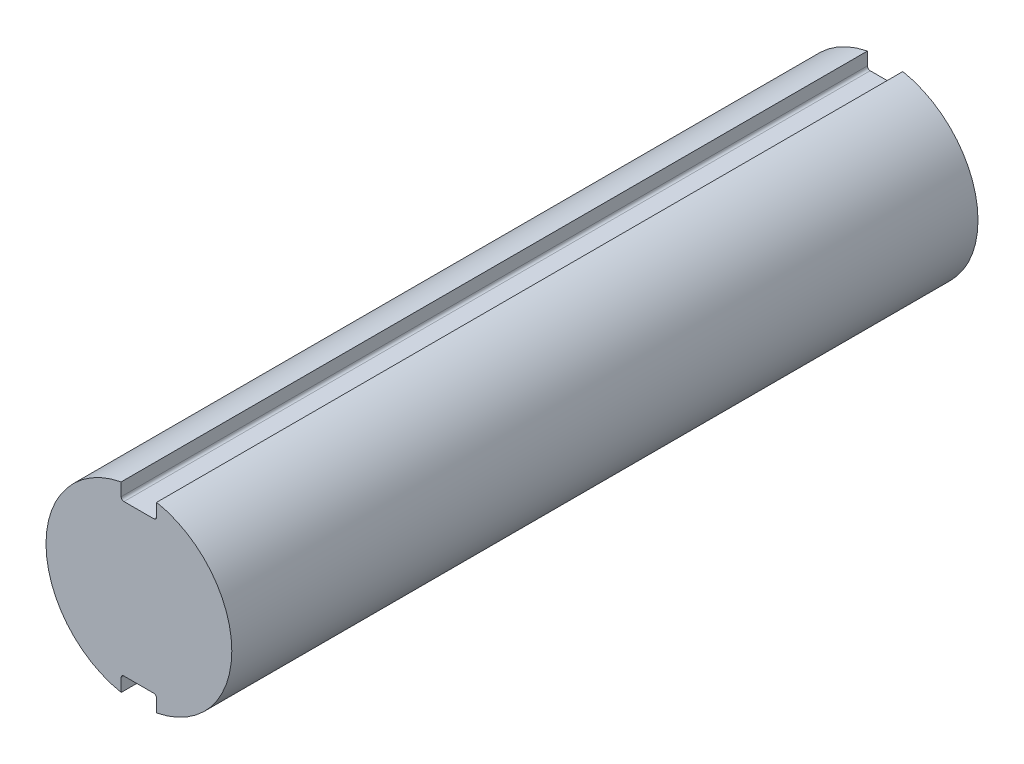
ISO-10303-21;
HEADER;
FILE_DESCRIPTION(('STEP AP214'),'2;1');
FILE_NAME('part.step','',(''),(''),'','','');
FILE_SCHEMA(('AUTOMOTIVE_DESIGN { 1 0 10303 214 1 1 1 1 }'));
ENDSEC;
DATA;
#1=APPLICATION_CONTEXT('core data for automotive mechanical design processes');
#2=APPLICATION_PROTOCOL_DEFINITION('international standard','automotive_design',2000,#1);
#3=PRODUCT_CONTEXT('',#1,'mechanical');
#4=PRODUCT('Part','Part','',(#3));
#5=PRODUCT_RELATED_PRODUCT_CATEGORY('part','',(#4));
#6=PRODUCT_DEFINITION_FORMATION('','',#4);
#7=PRODUCT_DEFINITION_CONTEXT('part definition',#1,'design');
#8=PRODUCT_DEFINITION('design','',#6,#7);
#9=PRODUCT_DEFINITION_SHAPE('','',#8);
#10=(LENGTH_UNIT() NAMED_UNIT(*) SI_UNIT(.MILLI.,.METRE.));
#11=(NAMED_UNIT(*) PLANE_ANGLE_UNIT() SI_UNIT($,.RADIAN.));
#12=(NAMED_UNIT(*) SI_UNIT($,.STERADIAN.) SOLID_ANGLE_UNIT());
#13=UNCERTAINTY_MEASURE_WITH_UNIT(LENGTH_MEASURE(1.E-05),#10,'distance_accuracy_value','');
#14=(GEOMETRIC_REPRESENTATION_CONTEXT(3) GLOBAL_UNCERTAINTY_ASSIGNED_CONTEXT((#13)) GLOBAL_UNIT_ASSIGNED_CONTEXT((#10,
#11,#12)) REPRESENTATION_CONTEXT('',''));
#15=CARTESIAN_POINT('',(0.,0.,0.));
#16=DIRECTION('',(0.,0.,1.));
#17=DIRECTION('',(1.,0.,0.));
#18=AXIS2_PLACEMENT_3D('',#15,#16,#17);
#19=CARTESIAN_POINT('',(-4.75000000000004,0.,200.));
#20=DIRECTION('',(-1.,0.,0.));
#21=DIRECTION('',(0.,-1.,0.));
#22=AXIS2_PLACEMENT_3D('',#19,#20,#21);
#23=PLANE('',#22);
#24=DIRECTION('',(0.,1.,0.));
#25=VECTOR('',#24,1.);
#26=CARTESIAN_POINT('',(-4.75000000000004,0.,0.));
#27=LINE('',#26,#25);
#28=CARTESIAN_POINT('',(-4.75,21.,0.));
#29=VERTEX_POINT('',#28);
#30=CARTESIAN_POINT('',(-4.74999999999999,24.4427392081984,0.));
#31=VERTEX_POINT('',#30);
#32=EDGE_CURVE('E153',#29,#31,#27,.T.);
#33=ORIENTED_EDGE('',*,*,#32,.T.);
#34=DIRECTION('',(0.,0.,-1.));
#35=VECTOR('',#34,1.);
#36=CARTESIAN_POINT('',(-4.74999999999999,24.4427392081984,200.));
#37=LINE('',#36,#35);
#38=CARTESIAN_POINT('',(-4.74999999999999,24.4427392081984,200.));
#39=VERTEX_POINT('',#38);
#40=EDGE_CURVE('E11',#39,#31,#37,.T.);
#41=ORIENTED_EDGE('',*,*,#40,.F.);
#42=DIRECTION('',(0.,1.,0.));
#43=VECTOR('',#42,1.);
#44=CARTESIAN_POINT('',(-4.75000000000004,0.,200.));
#45=LINE('',#44,#43);
#46=CARTESIAN_POINT('',(-4.75,21.,200.));
#47=VERTEX_POINT('',#46);
#48=EDGE_CURVE('E184',#47,#39,#45,.T.);
#49=ORIENTED_EDGE('',*,*,#48,.F.);
#50=DIRECTION('',(0.,0.,-1.));
#51=VECTOR('',#50,1.);
#52=CARTESIAN_POINT('',(-4.75,21.,200.));
#53=LINE('',#52,#51);
#54=EDGE_CURVE('E49',#47,#29,#53,.T.);
#55=ORIENTED_EDGE('',*,*,#54,.T.);
#56=EDGE_LOOP('',(#33,#41,#49,#55));
#57=FACE_BOUND('',#56,.T.);
#58=ADVANCED_FACE('F33',(#57),#23,.F.);
#59=CARTESIAN_POINT('',(0.,0.,200.));
#60=DIRECTION('',(0.,0.,-1.));
#61=DIRECTION('',(-1.,0.,0.));
#62=AXIS2_PLACEMENT_3D('',#59,#60,#61);
#63=CYLINDRICAL_SURFACE('',#62,24.9);
#64=CARTESIAN_POINT('',(0.,0.,0.));
#65=DIRECTION('',(0.,0.,1.));
#66=DIRECTION('',(1.,0.,0.));
#67=AXIS2_PLACEMENT_3D('',#64,#65,#66);
#68=CIRCLE('',#67,24.9);
#69=CARTESIAN_POINT('',(-4.75000000000022,-24.4427392081984,0.));
#70=VERTEX_POINT('',#69);
#71=EDGE_CURVE('E155',#31,#70,#68,.T.);
#72=ORIENTED_EDGE('',*,*,#71,.T.);
#73=DIRECTION('',(0.,0.,-1.));
#74=VECTOR('',#73,1.);
#75=CARTESIAN_POINT('',(-4.75000000000022,-24.4427392081984,200.));
#76=LINE('',#75,#74);
#77=CARTESIAN_POINT('',(-4.75000000000022,-24.4427392081984,200.));
#78=VERTEX_POINT('',#77);
#79=EDGE_CURVE('E41',#78,#70,#76,.T.);
#80=ORIENTED_EDGE('',*,*,#79,.F.);
#81=CARTESIAN_POINT('',(0.,0.,200.));
#82=DIRECTION('',(0.,0.,1.));
#83=DIRECTION('',(1.,0.,0.));
#84=AXIS2_PLACEMENT_3D('',#81,#82,#83);
#85=CIRCLE('',#84,24.9);
#86=EDGE_CURVE('E99',#39,#78,#85,.T.);
#87=ORIENTED_EDGE('',*,*,#86,.F.);
#88=ORIENTED_EDGE('',*,*,#40,.T.);
#89=EDGE_LOOP('',(#72,#80,#87,#88));
#90=FACE_BOUND('',#89,.T.);
#91=ADVANCED_FACE('F206',(#90),#63,.T.);
#92=CARTESIAN_POINT('',(-4.75,0.,200.));
#93=DIRECTION('',(1.,0.,0.));
#94=DIRECTION('',(0.,1.,0.));
#95=AXIS2_PLACEMENT_3D('',#92,#93,#94);
#96=PLANE('',#95);
#97=DIRECTION('',(0.,-1.,0.));
#98=VECTOR('',#97,1.);
#99=CARTESIAN_POINT('',(-4.75,0.,0.));
#100=LINE('',#99,#98);
#101=CARTESIAN_POINT('',(-4.75000000000019,-21.,0.));
#102=VERTEX_POINT('',#101);
#103=EDGE_CURVE('E158',#102,#70,#100,.T.);
#104=ORIENTED_EDGE('',*,*,#103,.F.);
#105=DIRECTION('',(0.,0.,-1.));
#106=VECTOR('',#105,1.);
#107=CARTESIAN_POINT('',(-4.75000000000019,-21.,200.));
#108=LINE('',#107,#106);
#109=CARTESIAN_POINT('',(-4.75000000000019,-21.,200.));
#110=VERTEX_POINT('',#109);
#111=EDGE_CURVE('E199',#110,#102,#108,.T.);
#112=ORIENTED_EDGE('',*,*,#111,.F.);
#113=DIRECTION('',(0.,-1.,0.));
#114=VECTOR('',#113,1.);
#115=CARTESIAN_POINT('',(-4.75,0.,200.));
#116=LINE('',#115,#114);
#117=EDGE_CURVE('E205',#110,#78,#116,.T.);
#118=ORIENTED_EDGE('',*,*,#117,.T.);
#119=ORIENTED_EDGE('',*,*,#79,.T.);
#120=EDGE_LOOP('',(#104,#112,#118,#119));
#121=FACE_BOUND('',#120,.T.);
#122=ADVANCED_FACE('F203',(#121),#96,.T.);
#123=CARTESIAN_POINT('',(-4.00000000000016,-21.,200.));
#124=DIRECTION('',(0.,0.,-1.));
#125=DIRECTION('',(-1.,0.,0.));
#126=AXIS2_PLACEMENT_3D('',#123,#124,#125);
#127=CYLINDRICAL_SURFACE('',#126,0.750000000000015);
#128=CARTESIAN_POINT('',(-4.00000000000016,-21.,0.));
#129=DIRECTION('',(0.,0.,1.));
#130=DIRECTION('',(1.,0.,0.));
#131=AXIS2_PLACEMENT_3D('',#128,#129,#130);
#132=CIRCLE('',#131,0.750000000000015);
#133=CARTESIAN_POINT('',(-4.00000000000015,-20.25,0.));
#134=VERTEX_POINT('',#133);
#135=EDGE_CURVE('E161',#134,#102,#132,.T.);
#136=ORIENTED_EDGE('',*,*,#135,.F.);
#137=DIRECTION('',(0.,0.,-1.));
#138=VECTOR('',#137,1.);
#139=CARTESIAN_POINT('',(-4.00000000000015,-20.25,200.));
#140=LINE('',#139,#138);
#141=CARTESIAN_POINT('',(-4.00000000000015,-20.25,200.));
#142=VERTEX_POINT('',#141);
#143=EDGE_CURVE('E197',#142,#134,#140,.T.);
#144=ORIENTED_EDGE('',*,*,#143,.F.);
#145=CARTESIAN_POINT('',(-4.00000000000016,-21.,200.));
#146=DIRECTION('',(0.,0.,1.));
#147=DIRECTION('',(1.,0.,0.));
#148=AXIS2_PLACEMENT_3D('',#145,#146,#147);
#149=CIRCLE('',#148,0.750000000000015);
#150=EDGE_CURVE('E216',#142,#110,#149,.T.);
#151=ORIENTED_EDGE('',*,*,#150,.T.);
#152=ORIENTED_EDGE('',*,*,#111,.T.);
#153=EDGE_LOOP('',(#136,#144,#151,#152));
#154=FACE_BOUND('',#153,.T.);
#155=ADVANCED_FACE('F213',(#154),#127,.F.);
#156=CARTESIAN_POINT('',(1.36999786515266E-12,-20.2499999999997,200.));
#157=DIRECTION('',(0.,-1.,0.));
#158=DIRECTION('',(1.,0.,0.));
#159=AXIS2_PLACEMENT_3D('',#156,#157,#158);
#160=PLANE('',#159);
#161=DIRECTION('',(-1.,0.,0.));
#162=VECTOR('',#161,1.);
#163=CARTESIAN_POINT('',(1.36999786515266E-12,-20.2499999999997,0.));
#164=LINE('',#163,#162);
#165=CARTESIAN_POINT('',(3.99999999999982,-20.25,0.));
#166=VERTEX_POINT('',#165);
#167=EDGE_CURVE('E164',#166,#134,#164,.T.);
#168=ORIENTED_EDGE('',*,*,#167,.F.);
#169=DIRECTION('',(0.,0.,-1.));
#170=VECTOR('',#169,1.);
#171=CARTESIAN_POINT('',(3.99999999999982,-20.25,200.));
#172=LINE('',#171,#170);
#173=CARTESIAN_POINT('',(3.99999999999982,-20.25,200.));
#174=VERTEX_POINT('',#173);
#175=EDGE_CURVE('E195',#174,#166,#172,.T.);
#176=ORIENTED_EDGE('',*,*,#175,.F.);
#177=DIRECTION('',(-1.,0.,0.));
#178=VECTOR('',#177,1.);
#179=CARTESIAN_POINT('',(1.36999786515266E-12,-20.2499999999997,200.));
#180=LINE('',#179,#178);
#181=EDGE_CURVE('E220',#174,#142,#180,.T.);
#182=ORIENTED_EDGE('',*,*,#181,.T.);
#183=ORIENTED_EDGE('',*,*,#143,.T.);
#184=EDGE_LOOP('',(#168,#176,#182,#183));
#185=FACE_BOUND('',#184,.T.);
#186=ADVANCED_FACE('F258',(#185),#160,.T.);
#187=CARTESIAN_POINT('',(3.99999999999984,-21.0000000000001,200.));
#188=DIRECTION('',(0.,0.,-1.));
#189=DIRECTION('',(-1.,0.,0.));
#190=AXIS2_PLACEMENT_3D('',#187,#188,#189);
#191=CYLINDRICAL_SURFACE('',#190,0.750000000000013);
#192=CARTESIAN_POINT('',(3.99999999999984,-21.0000000000001,0.));
#193=DIRECTION('',(0.,0.,1.));
#194=DIRECTION('',(1.,0.,0.));
#195=AXIS2_PLACEMENT_3D('',#192,#193,#194);
#196=CIRCLE('',#195,0.750000000000013);
#197=CARTESIAN_POINT('',(4.74999999999985,-21.0000000000001,0.));
#198=VERTEX_POINT('',#197);
#199=EDGE_CURVE('E167',#198,#166,#196,.T.);
#200=ORIENTED_EDGE('',*,*,#199,.F.);
#201=DIRECTION('',(0.,0.,-1.));
#202=VECTOR('',#201,1.);
#203=CARTESIAN_POINT('',(4.74999999999985,-21.0000000000001,200.));
#204=LINE('',#203,#202);
#205=CARTESIAN_POINT('',(4.74999999999985,-21.0000000000001,200.));
#206=VERTEX_POINT('',#205);
#207=EDGE_CURVE('E193',#206,#198,#204,.T.);
#208=ORIENTED_EDGE('',*,*,#207,.F.);
#209=CARTESIAN_POINT('',(3.99999999999984,-21.0000000000001,200.));
#210=DIRECTION('',(0.,0.,1.));
#211=DIRECTION('',(1.,0.,0.));
#212=AXIS2_PLACEMENT_3D('',#209,#210,#211);
#213=CIRCLE('',#212,0.750000000000013);
#214=EDGE_CURVE('E226',#206,#174,#213,.T.);
#215=ORIENTED_EDGE('',*,*,#214,.T.);
#216=ORIENTED_EDGE('',*,*,#175,.T.);
#217=EDGE_LOOP('',(#200,#208,#215,#216));
#218=FACE_BOUND('',#217,.T.);
#219=ADVANCED_FACE('F261',(#218),#191,.F.);
#220=CARTESIAN_POINT('',(4.75000000000004,0.,200.));
#221=DIRECTION('',(1.,0.,0.));
#222=DIRECTION('',(0.,1.,0.));
#223=AXIS2_PLACEMENT_3D('',#220,#221,#222);
#224=PLANE('',#223);
#225=DIRECTION('',(0.,-1.,0.));
#226=VECTOR('',#225,1.);
#227=CARTESIAN_POINT('',(4.75000000000004,0.,0.));
#228=LINE('',#227,#226);
#229=CARTESIAN_POINT('',(4.74999999999982,-24.4427392081985,0.));
#230=VERTEX_POINT('',#229);
#231=EDGE_CURVE('E170',#198,#230,#228,.T.);
#232=ORIENTED_EDGE('',*,*,#231,.T.);
#233=DIRECTION('',(0.,0.,-1.));
#234=VECTOR('',#233,1.);
#235=CARTESIAN_POINT('',(4.74999999999982,-24.4427392081985,200.));
#236=LINE('',#235,#234);
#237=CARTESIAN_POINT('',(4.74999999999982,-24.4427392081985,200.));
#238=VERTEX_POINT('',#237);
#239=EDGE_CURVE('E190',#238,#230,#236,.T.);
#240=ORIENTED_EDGE('',*,*,#239,.F.);
#241=DIRECTION('',(0.,-1.,0.));
#242=VECTOR('',#241,1.);
#243=CARTESIAN_POINT('',(4.75000000000004,0.,200.));
#244=LINE('',#243,#242);
#245=EDGE_CURVE('E229',#206,#238,#244,.T.);
#246=ORIENTED_EDGE('',*,*,#245,.F.);
#247=ORIENTED_EDGE('',*,*,#207,.T.);
#248=EDGE_LOOP('',(#232,#240,#246,#247));
#249=FACE_BOUND('',#248,.T.);
#250=ADVANCED_FACE('F265',(#249),#224,.F.);
#251=CARTESIAN_POINT('',(0.,0.,200.));
#252=DIRECTION('',(0.,0.,-1.));
#253=DIRECTION('',(-1.,0.,0.));
#254=AXIS2_PLACEMENT_3D('',#251,#252,#253);
#255=CYLINDRICAL_SURFACE('',#254,24.9);
#256=CARTESIAN_POINT('',(0.,0.,0.));
#257=DIRECTION('',(0.,0.,1.));
#258=DIRECTION('',(1.,0.,0.));
#259=AXIS2_PLACEMENT_3D('',#256,#257,#258);
#260=CIRCLE('',#259,24.9);
#261=CARTESIAN_POINT('',(4.75000000000005,24.4427392081984,0.));
#262=VERTEX_POINT('',#261);
#263=EDGE_CURVE('E172',#230,#262,#260,.T.);
#264=ORIENTED_EDGE('',*,*,#263,.T.);
#265=DIRECTION('',(0.,0.,-1.));
#266=VECTOR('',#265,1.);
#267=CARTESIAN_POINT('',(4.75000000000005,24.4427392081984,200.));
#268=LINE('',#267,#266);
#269=CARTESIAN_POINT('',(4.75000000000005,24.4427392081984,200.));
#270=VERTEX_POINT('',#269);
#271=EDGE_CURVE('E188',#270,#262,#268,.T.);
#272=ORIENTED_EDGE('',*,*,#271,.F.);
#273=CARTESIAN_POINT('',(0.,0.,200.));
#274=DIRECTION('',(0.,0.,1.));
#275=DIRECTION('',(1.,0.,0.));
#276=AXIS2_PLACEMENT_3D('',#273,#274,#275);
#277=CIRCLE('',#276,24.9);
#278=EDGE_CURVE('E231',#238,#270,#277,.T.);
#279=ORIENTED_EDGE('',*,*,#278,.F.);
#280=ORIENTED_EDGE('',*,*,#239,.T.);
#281=EDGE_LOOP('',(#264,#272,#279,#280));
#282=FACE_BOUND('',#281,.T.);
#283=ADVANCED_FACE('F269',(#282),#255,.T.);
#284=CARTESIAN_POINT('',(4.75,0.,200.));
#285=DIRECTION('',(-1.,0.,0.));
#286=DIRECTION('',(0.,-1.,0.));
#287=AXIS2_PLACEMENT_3D('',#284,#285,#286);
#288=PLANE('',#287);
#289=DIRECTION('',(0.,1.,0.));
#290=VECTOR('',#289,1.);
#291=CARTESIAN_POINT('',(4.75,0.,0.));
#292=LINE('',#291,#290);
#293=CARTESIAN_POINT('',(4.75000000000004,21.,0.));
#294=VERTEX_POINT('',#293);
#295=EDGE_CURVE('E175',#294,#262,#292,.T.);
#296=ORIENTED_EDGE('',*,*,#295,.F.);
#297=DIRECTION('',(0.,0.,-1.));
#298=VECTOR('',#297,1.);
#299=CARTESIAN_POINT('',(4.75000000000004,21.,200.));
#300=LINE('',#299,#298);
#301=CARTESIAN_POINT('',(4.75000000000004,21.,200.));
#302=VERTEX_POINT('',#301);
#303=EDGE_CURVE('E136',#302,#294,#300,.T.);
#304=ORIENTED_EDGE('',*,*,#303,.F.);
#305=DIRECTION('',(0.,1.,0.));
#306=VECTOR('',#305,1.);
#307=CARTESIAN_POINT('',(4.75,0.,200.));
#308=LINE('',#307,#306);
#309=EDGE_CURVE('E145',#302,#270,#308,.T.);
#310=ORIENTED_EDGE('',*,*,#309,.T.);
#311=ORIENTED_EDGE('',*,*,#271,.T.);
#312=EDGE_LOOP('',(#296,#304,#310,#311));
#313=FACE_BOUND('',#312,.T.);
#314=ADVANCED_FACE('F234',(#313),#288,.T.);
#315=CARTESIAN_POINT('',(4.00000000000001,21.,200.));
#316=DIRECTION('',(0.,0.,-1.));
#317=DIRECTION('',(-1.,0.,0.));
#318=AXIS2_PLACEMENT_3D('',#315,#316,#317);
#319=CYLINDRICAL_SURFACE('',#318,0.750000000000015);
#320=CARTESIAN_POINT('',(4.00000000000001,21.,0.));
#321=DIRECTION('',(0.,0.,1.));
#322=DIRECTION('',(1.,0.,0.));
#323=AXIS2_PLACEMENT_3D('',#320,#321,#322);
#324=CIRCLE('',#323,0.750000000000015);
#325=CARTESIAN_POINT('',(4.00000000000001,20.25,0.));
#326=VERTEX_POINT('',#325);
#327=EDGE_CURVE('E132',#326,#294,#324,.T.);
#328=ORIENTED_EDGE('',*,*,#327,.F.);
#329=DIRECTION('',(0.,0.,-1.));
#330=VECTOR('',#329,1.);
#331=CARTESIAN_POINT('',(4.00000000000001,20.25,200.));
#332=LINE('',#331,#330);
#333=CARTESIAN_POINT('',(4.00000000000001,20.25,200.));
#334=VERTEX_POINT('',#333);
#335=EDGE_CURVE('E127',#334,#326,#332,.T.);
#336=ORIENTED_EDGE('',*,*,#335,.F.);
#337=CARTESIAN_POINT('',(4.00000000000001,21.,200.));
#338=DIRECTION('',(0.,0.,1.));
#339=DIRECTION('',(1.,0.,0.));
#340=AXIS2_PLACEMENT_3D('',#337,#338,#339);
#341=CIRCLE('',#340,0.750000000000015);
#342=EDGE_CURVE('E130',#334,#302,#341,.T.);
#343=ORIENTED_EDGE('',*,*,#342,.T.);
#344=ORIENTED_EDGE('',*,*,#303,.T.);
#345=EDGE_LOOP('',(#328,#336,#343,#344));
#346=FACE_BOUND('',#345,.T.);
#347=ADVANCED_FACE('F129',(#346),#319,.F.);
#348=CARTESIAN_POINT('',(-1.51051046670678E-12,20.2499999999997,200.));
#349=DIRECTION('',(0.,1.,0.));
#350=DIRECTION('',(-1.,0.,0.));
#351=AXIS2_PLACEMENT_3D('',#348,#349,#350);
#352=PLANE('',#351);
#353=DIRECTION('',(1.,0.,0.));
#354=VECTOR('',#353,1.);
#355=CARTESIAN_POINT('',(-1.51051046670678E-12,20.2499999999997,0.));
#356=LINE('',#355,#354);
#357=CARTESIAN_POINT('',(-4.00000000000331,20.25,0.));
#358=VERTEX_POINT('',#357);
#359=EDGE_CURVE('E179',#358,#326,#356,.T.);
#360=ORIENTED_EDGE('',*,*,#359,.F.);
#361=DIRECTION('',(0.,0.,-1.));
#362=VECTOR('',#361,1.);
#363=CARTESIAN_POINT('',(-4.00000000000331,20.25,200.));
#364=LINE('',#363,#362);
#365=CARTESIAN_POINT('',(-4.00000000000331,20.25,200.));
#366=VERTEX_POINT('',#365);
#367=EDGE_CURVE('E87',#366,#358,#364,.T.);
#368=ORIENTED_EDGE('',*,*,#367,.F.);
#369=DIRECTION('',(1.,0.,0.));
#370=VECTOR('',#369,1.);
#371=CARTESIAN_POINT('',(-1.51051046670678E-12,20.2499999999997,200.));
#372=LINE('',#371,#370);
#373=EDGE_CURVE('E143',#366,#334,#372,.T.);
#374=ORIENTED_EDGE('',*,*,#373,.T.);
#375=ORIENTED_EDGE('',*,*,#335,.T.);
#376=EDGE_LOOP('',(#360,#368,#374,#375));
#377=FACE_BOUND('',#376,.T.);
#378=ADVANCED_FACE('F147',(#377),#352,.T.);
#379=CARTESIAN_POINT('',(-3.99999999999999,21.,200.));
#380=DIRECTION('',(0.,0.,-1.));
#381=DIRECTION('',(-1.,0.,0.));
#382=AXIS2_PLACEMENT_3D('',#379,#380,#381);
#383=CYLINDRICAL_SURFACE('',#382,0.750000000000015);
#384=CARTESIAN_POINT('',(-3.99999999999999,21.,0.));
#385=DIRECTION('',(0.,0.,1.));
#386=DIRECTION('',(1.,0.,0.));
#387=AXIS2_PLACEMENT_3D('',#384,#385,#386);
#388=CIRCLE('',#387,0.750000000000015);
#389=EDGE_CURVE('E181',#29,#358,#388,.T.);
#390=ORIENTED_EDGE('',*,*,#389,.F.);
#391=ORIENTED_EDGE('',*,*,#54,.F.);
#392=CARTESIAN_POINT('',(-3.99999999999999,21.,200.));
#393=DIRECTION('',(0.,0.,1.));
#394=DIRECTION('',(1.,0.,0.));
#395=AXIS2_PLACEMENT_3D('',#392,#393,#394);
#396=CIRCLE('',#395,0.750000000000015);
#397=EDGE_CURVE('E148',#47,#366,#396,.T.);
#398=ORIENTED_EDGE('',*,*,#397,.T.);
#399=ORIENTED_EDGE('',*,*,#367,.T.);
#400=EDGE_LOOP('',(#390,#391,#398,#399));
#401=FACE_BOUND('',#400,.T.);
#402=ADVANCED_FACE('F237',(#401),#383,.F.);
#403=CARTESIAN_POINT('',(0.,0.,200.));
#404=DIRECTION('',(0.,0.,1.));
#405=DIRECTION('',(1.,0.,0.));
#406=AXIS2_PLACEMENT_3D('',#403,#404,#405);
#407=PLANE('',#406);
#408=ORIENTED_EDGE('',*,*,#48,.T.);
#409=ORIENTED_EDGE('',*,*,#86,.T.);
#410=ORIENTED_EDGE('',*,*,#117,.F.);
#411=ORIENTED_EDGE('',*,*,#150,.F.);
#412=ORIENTED_EDGE('',*,*,#181,.F.);
#413=ORIENTED_EDGE('',*,*,#214,.F.);
#414=ORIENTED_EDGE('',*,*,#245,.T.);
#415=ORIENTED_EDGE('',*,*,#278,.T.);
#416=ORIENTED_EDGE('',*,*,#309,.F.);
#417=ORIENTED_EDGE('',*,*,#342,.F.);
#418=ORIENTED_EDGE('',*,*,#373,.F.);
#419=ORIENTED_EDGE('',*,*,#397,.F.);
#420=EDGE_LOOP('',(#408,#409,#410,#411,#412,#413,#414,#415,#416,#417,#418,#419));
#421=FACE_BOUND('',#420,.T.);
#422=ADVANCED_FACE('F141',(#421),#407,.T.);
#423=CARTESIAN_POINT('',(0.,0.,0.));
#424=DIRECTION('',(0.,0.,1.));
#425=DIRECTION('',(1.,0.,0.));
#426=AXIS2_PLACEMENT_3D('',#423,#424,#425);
#427=PLANE('',#426);
#428=ORIENTED_EDGE('',*,*,#32,.F.);
#429=ORIENTED_EDGE('',*,*,#389,.T.);
#430=ORIENTED_EDGE('',*,*,#359,.T.);
#431=ORIENTED_EDGE('',*,*,#327,.T.);
#432=ORIENTED_EDGE('',*,*,#295,.T.);
#433=ORIENTED_EDGE('',*,*,#263,.F.);
#434=ORIENTED_EDGE('',*,*,#231,.F.);
#435=ORIENTED_EDGE('',*,*,#199,.T.);
#436=ORIENTED_EDGE('',*,*,#167,.T.);
#437=ORIENTED_EDGE('',*,*,#135,.T.);
#438=ORIENTED_EDGE('',*,*,#103,.T.);
#439=ORIENTED_EDGE('',*,*,#71,.F.);
#440=EDGE_LOOP('',(#428,#429,#430,#431,#432,#433,#434,#435,#436,#437,#438,#439));
#441=FACE_BOUND('',#440,.T.);
#442=ADVANCED_FACE('F209',(#441),#427,.F.);
#443=CLOSED_SHELL('',(#58,#91,#122,#155,#186,#219,#250,#283,#314,#347,#378,#402,#422,#442));
#444=MANIFOLD_SOLID_BREP('B2',#443);
#445=ADVANCED_BREP_SHAPE_REPRESENTATION('',(#18,#444),#14);
#446=SHAPE_DEFINITION_REPRESENTATION(#9,#445);
ENDSEC;
END-ISO-10303-21;
